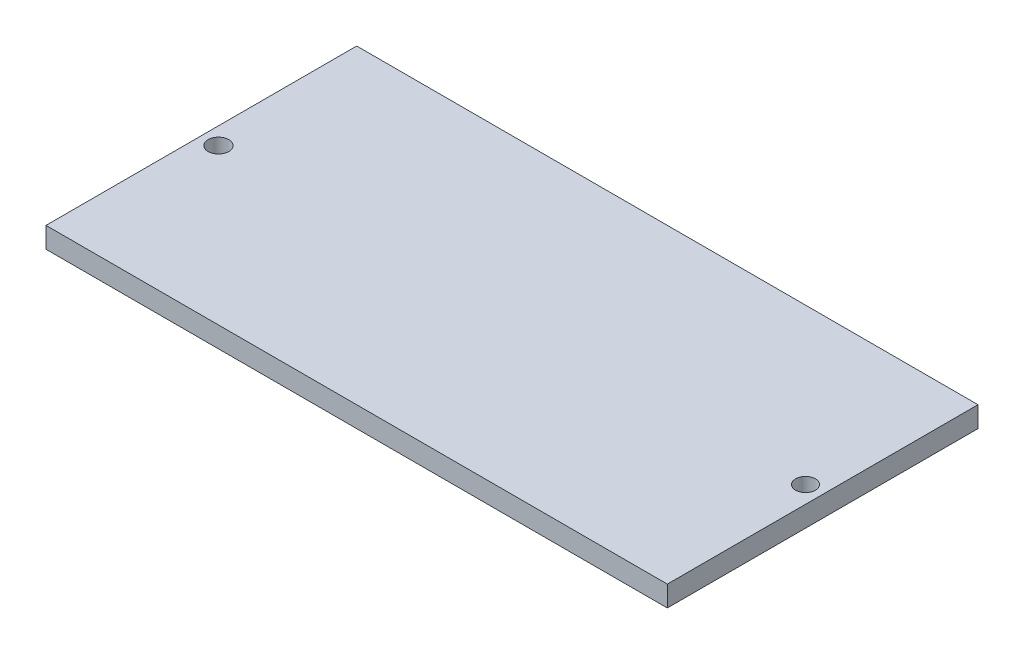
ISO-10303-21;
HEADER;
FILE_DESCRIPTION(('STEP AP214'),'2;1');
FILE_NAME('part.step','',(''),(''),'','','');
FILE_SCHEMA(('AUTOMOTIVE_DESIGN { 1 0 10303 214 1 1 1 1 }'));
ENDSEC;
DATA;
#1=APPLICATION_CONTEXT('core data for automotive mechanical design processes');
#2=APPLICATION_PROTOCOL_DEFINITION('international standard','automotive_design',2000,#1);
#3=PRODUCT_CONTEXT('',#1,'mechanical');
#4=PRODUCT('Part','Part','',(#3));
#5=PRODUCT_RELATED_PRODUCT_CATEGORY('part','',(#4));
#6=PRODUCT_DEFINITION_FORMATION('','',#4);
#7=PRODUCT_DEFINITION_CONTEXT('part definition',#1,'design');
#8=PRODUCT_DEFINITION('design','',#6,#7);
#9=PRODUCT_DEFINITION_SHAPE('','',#8);
#10=(LENGTH_UNIT() NAMED_UNIT(*) SI_UNIT(.MILLI.,.METRE.));
#11=(NAMED_UNIT(*) PLANE_ANGLE_UNIT() SI_UNIT($,.RADIAN.));
#12=(NAMED_UNIT(*) SI_UNIT($,.STERADIAN.) SOLID_ANGLE_UNIT());
#13=UNCERTAINTY_MEASURE_WITH_UNIT(LENGTH_MEASURE(1.E-05),#10,'distance_accuracy_value','');
#14=(GEOMETRIC_REPRESENTATION_CONTEXT(3) GLOBAL_UNCERTAINTY_ASSIGNED_CONTEXT((#13)) GLOBAL_UNIT_ASSIGNED_CONTEXT((#10,
#11,#12)) REPRESENTATION_CONTEXT('',''));
#15=CARTESIAN_POINT('',(0.,0.,0.));
#16=DIRECTION('',(0.,0.,1.));
#17=DIRECTION('',(1.,0.,0.));
#18=AXIS2_PLACEMENT_3D('',#15,#16,#17);
#19=CARTESIAN_POINT('',(0.,0.,0.));
#20=DIRECTION('',(0.,1.,0.));
#21=DIRECTION('',(0.,0.,1.));
#22=AXIS2_PLACEMENT_3D('',#19,#20,#21);
#23=PLANE('',#22);
#24=DIRECTION('',(-1.,0.,0.));
#25=VECTOR('',#24,1.);
#26=CARTESIAN_POINT('',(-7.4987736083239,0.,-10.));
#27=LINE('',#26,#25);
#28=CARTESIAN_POINT('',(-7.4987736083239,0.,-10.));
#29=VERTEX_POINT('',#28);
#30=CARTESIAN_POINT('',(-8.96194894653345,0.,-10.));
#31=VERTEX_POINT('',#30);
#32=EDGE_CURVE('E196',#29,#31,#27,.T.);
#33=ORIENTED_EDGE('',*,*,#32,.T.);
#34=DIRECTION('',(0.,0.,1.));
#35=VECTOR('',#34,1.);
#36=CARTESIAN_POINT('',(-8.96194894653345,0.,-10.));
#37=LINE('',#36,#35);
#38=CARTESIAN_POINT('',(-8.96194894653345,0.,10.));
#39=VERTEX_POINT('',#38);
#40=EDGE_CURVE('E181',#31,#39,#37,.T.);
#41=ORIENTED_EDGE('',*,*,#40,.T.);
#42=DIRECTION('',(-1.,0.,0.));
#43=VECTOR('',#42,1.);
#44=CARTESIAN_POINT('',(-7.4987736083239,0.,10.));
#45=LINE('',#44,#43);
#46=CARTESIAN_POINT('',(-7.4987736083239,0.,10.));
#47=VERTEX_POINT('',#46);
#48=EDGE_CURVE('E186',#47,#39,#45,.T.);
#49=ORIENTED_EDGE('',*,*,#48,.F.);
#50=DIRECTION('',(0.,0.,1.));
#51=VECTOR('',#50,1.);
#52=CARTESIAN_POINT('',(-7.4987736083239,0.,-10.));
#53=LINE('',#52,#51);
#54=EDGE_CURVE('E282',#29,#47,#53,.T.);
#55=ORIENTED_EDGE('',*,*,#54,.F.);
#56=EDGE_LOOP('',(#33,#41,#49,#55));
#57=FACE_BOUND('',#56,.T.);
#58=DIRECTION('',(0.,0.,1.));
#59=VECTOR('',#58,1.);
#60=CARTESIAN_POINT('',(22.508563909056,0.,-10.));
#61=LINE('',#60,#59);
#62=CARTESIAN_POINT('',(22.508563909056,0.,-10.));
#63=VERTEX_POINT('',#62);
#64=CARTESIAN_POINT('',(22.508563909056,0.,10.));
#65=VERTEX_POINT('',#64);
#66=EDGE_CURVE('E211',#63,#65,#61,.T.);
#67=ORIENTED_EDGE('',*,*,#66,.F.);
#68=DIRECTION('',(-1.,0.,0.));
#69=VECTOR('',#68,1.);
#70=CARTESIAN_POINT('',(22.508563909056,0.,-10.));
#71=LINE('',#70,#69);
#72=CARTESIAN_POINT('',(21.0453885708464,0.,-10.));
#73=VERTEX_POINT('',#72);
#74=EDGE_CURVE('E235',#63,#73,#71,.T.);
#75=ORIENTED_EDGE('',*,*,#74,.T.);
#76=DIRECTION('',(0.,0.,1.));
#77=VECTOR('',#76,1.);
#78=CARTESIAN_POINT('',(21.0453885708464,0.,-10.));
#79=LINE('',#78,#77);
#80=CARTESIAN_POINT('',(21.0453885708464,0.,10.));
#81=VERTEX_POINT('',#80);
#82=EDGE_CURVE('E214',#73,#81,#79,.T.);
#83=ORIENTED_EDGE('',*,*,#82,.T.);
#84=DIRECTION('',(-1.,0.,0.));
#85=VECTOR('',#84,1.);
#86=CARTESIAN_POINT('',(22.508563909056,0.,10.));
#87=LINE('',#86,#85);
#88=EDGE_CURVE('E258',#65,#81,#87,.T.);
#89=ORIENTED_EDGE('',*,*,#88,.F.);
#90=EDGE_LOOP('',(#67,#75,#83,#89));
#91=FACE_BOUND('',#90,.T.);
#92=DIRECTION('',(0.,0.,1.));
#93=VECTOR('',#92,1.);
#94=CARTESIAN_POINT('',(8.96194894653345,0.,-10.));
#95=LINE('',#94,#93);
#96=CARTESIAN_POINT('',(8.96194894653345,0.,-10.));
#97=VERTEX_POINT('',#96);
#98=CARTESIAN_POINT('',(8.96194894653345,0.,10.));
#99=VERTEX_POINT('',#98);
#100=EDGE_CURVE('E220',#97,#99,#95,.T.);
#101=ORIENTED_EDGE('',*,*,#100,.F.);
#102=DIRECTION('',(-1.,0.,0.));
#103=VECTOR('',#102,1.);
#104=CARTESIAN_POINT('',(7.4987736083239,0.,-10.));
#105=LINE('',#104,#103);
#106=CARTESIAN_POINT('',(7.4987736083239,0.,-10.));
#107=VERTEX_POINT('',#106);
#108=EDGE_CURVE('E208',#97,#107,#105,.T.);
#109=ORIENTED_EDGE('',*,*,#108,.T.);
#110=DIRECTION('',(0.,0.,1.));
#111=VECTOR('',#110,1.);
#112=CARTESIAN_POINT('',(7.4987736083239,0.,-10.));
#113=LINE('',#112,#111);
#114=CARTESIAN_POINT('',(7.4987736083239,0.,10.));
#115=VERTEX_POINT('',#114);
#116=EDGE_CURVE('E223',#107,#115,#113,.T.);
#117=ORIENTED_EDGE('',*,*,#116,.T.);
#118=DIRECTION('',(-1.,0.,0.));
#119=VECTOR('',#118,1.);
#120=CARTESIAN_POINT('',(7.4987736083239,0.,10.));
#121=LINE('',#120,#119);
#122=EDGE_CURVE('E246',#99,#115,#121,.T.);
#123=ORIENTED_EDGE('',*,*,#122,.F.);
#124=EDGE_LOOP('',(#101,#109,#117,#123));
#125=FACE_BOUND('',#124,.T.);
#126=CARTESIAN_POINT('',(28.3555340173799,0.,0.));
#127=DIRECTION('',(0.,1.,0.));
#128=DIRECTION('',(0.,0.,1.));
#129=AXIS2_PLACEMENT_3D('',#126,#127,#128);
#130=CIRCLE('',#129,0.958101179226239);
#131=CARTESIAN_POINT('',(28.3555340173799,0.,0.958101179226239));
#132=VERTEX_POINT('',#131);
#133=EDGE_CURVE('E269',#132,#132,#130,.T.);
#134=ORIENTED_EDGE('',*,*,#133,.T.);
#135=EDGE_LOOP('',(#134));
#136=FACE_BOUND('',#135,.T.);
#137=CARTESIAN_POINT('',(-28.3555340173799,0.,0.));
#138=DIRECTION('',(0.,1.,0.));
#139=DIRECTION('',(0.,0.,1.));
#140=AXIS2_PLACEMENT_3D('',#137,#138,#139);
#141=CIRCLE('',#140,1.);
#142=CARTESIAN_POINT('',(-28.3555340173799,0.,1.00000000000001));
#143=VERTEX_POINT('',#142);
#144=EDGE_CURVE('E279',#143,#143,#141,.T.);
#145=ORIENTED_EDGE('',*,*,#144,.T.);
#146=EDGE_LOOP('',(#145));
#147=FACE_BOUND('',#146,.T.);
#148=DIRECTION('',(0.,0.,1.));
#149=VECTOR('',#148,1.);
#150=CARTESIAN_POINT('',(-30.0073375173799,0.,15.0054759035991));
#151=LINE('',#150,#149);
#152=CARTESIAN_POINT('',(-30.0073375173799,0.,-15.0054759035991));
#153=VERTEX_POINT('',#152);
#154=CARTESIAN_POINT('',(-30.0073375173799,0.,15.0054759035991));
#155=VERTEX_POINT('',#154);
#156=EDGE_CURVE('E272',#153,#155,#151,.T.);
#157=ORIENTED_EDGE('',*,*,#156,.F.);
#158=DIRECTION('',(-1.,0.,0.));
#159=VECTOR('',#158,1.);
#160=CARTESIAN_POINT('',(30.0073375173799,0.,-15.0054759035991));
#161=LINE('',#160,#159);
#162=CARTESIAN_POINT('',(30.0073375173799,0.,-15.0054759035991));
#163=VERTEX_POINT('',#162);
#164=EDGE_CURVE('E287',#163,#153,#161,.T.);
#165=ORIENTED_EDGE('',*,*,#164,.F.);
#166=DIRECTION('',(0.,0.,-1.));
#167=VECTOR('',#166,1.);
#168=CARTESIAN_POINT('',(30.0073375173799,0.,15.0054759035991));
#169=LINE('',#168,#167);
#170=CARTESIAN_POINT('',(30.0073375173799,0.,15.0054759035991));
#171=VERTEX_POINT('',#170);
#172=EDGE_CURVE('E298',#171,#163,#169,.T.);
#173=ORIENTED_EDGE('',*,*,#172,.F.);
#174=DIRECTION('',(1.,0.,0.));
#175=VECTOR('',#174,1.);
#176=CARTESIAN_POINT('',(30.0073375173799,0.,15.0054759035991));
#177=LINE('',#176,#175);
#178=EDGE_CURVE('E296',#155,#171,#177,.T.);
#179=ORIENTED_EDGE('',*,*,#178,.F.);
#180=EDGE_LOOP('',(#157,#165,#173,#179));
#181=FACE_BOUND('',#180,.T.);
#182=DIRECTION('',(-1.,0.,0.));
#183=VECTOR('',#182,1.);
#184=CARTESIAN_POINT('',(-22.508563909056,0.,-10.));
#185=LINE('',#184,#183);
#186=CARTESIAN_POINT('',(-21.0453885708464,0.,-10.));
#187=VERTEX_POINT('',#186);
#188=CARTESIAN_POINT('',(-22.508563909056,0.,-10.));
#189=VERTEX_POINT('',#188);
#190=EDGE_CURVE('E594',#187,#189,#185,.T.);
#191=ORIENTED_EDGE('',*,*,#190,.T.);
#192=DIRECTION('',(0.,0.,1.));
#193=VECTOR('',#192,1.);
#194=CARTESIAN_POINT('',(-22.508563909056,0.,-10.));
#195=LINE('',#194,#193);
#196=CARTESIAN_POINT('',(-22.508563909056,0.,10.));
#197=VERTEX_POINT('',#196);
#198=EDGE_CURVE('E569',#189,#197,#195,.T.);
#199=ORIENTED_EDGE('',*,*,#198,.T.);
#200=DIRECTION('',(-1.,0.,0.));
#201=VECTOR('',#200,1.);
#202=CARTESIAN_POINT('',(-22.508563909056,0.,10.));
#203=LINE('',#202,#201);
#204=CARTESIAN_POINT('',(-21.0453885708464,0.,10.));
#205=VERTEX_POINT('',#204);
#206=EDGE_CURVE('E580',#205,#197,#203,.T.);
#207=ORIENTED_EDGE('',*,*,#206,.F.);
#208=DIRECTION('',(0.,0.,1.));
#209=VECTOR('',#208,1.);
#210=CARTESIAN_POINT('',(-21.0453885708464,0.,-10.));
#211=LINE('',#210,#209);
#212=EDGE_CURVE('E572',#187,#205,#211,.T.);
#213=ORIENTED_EDGE('',*,*,#212,.F.);
#214=EDGE_LOOP('',(#191,#199,#207,#213));
#215=FACE_BOUND('',#214,.T.);
#216=ADVANCED_FACE('F39',(#57,#91,#125,#136,#147,#181,#215),#23,.F.);
#217=CARTESIAN_POINT('',(-30.0073375173799,2.,15.0054759035991));
#218=DIRECTION('',(1.,0.,0.));
#219=DIRECTION('',(0.,0.,-1.));
#220=AXIS2_PLACEMENT_3D('',#217,#218,#219);
#221=PLANE('',#220);
#222=ORIENTED_EDGE('',*,*,#156,.T.);
#223=DIRECTION('',(0.,-1.,0.));
#224=VECTOR('',#223,1.);
#225=CARTESIAN_POINT('',(-30.0073375173799,2.,15.0054759035991));
#226=LINE('',#225,#224);
#227=CARTESIAN_POINT('',(-30.0073375173799,2.,15.0054759035991));
#228=VERTEX_POINT('',#227);
#229=EDGE_CURVE('E11',#228,#155,#226,.T.);
#230=ORIENTED_EDGE('',*,*,#229,.F.);
#231=DIRECTION('',(0.,0.,1.));
#232=VECTOR('',#231,1.);
#233=CARTESIAN_POINT('',(-30.0073375173799,2.,15.0054759035991));
#234=LINE('',#233,#232);
#235=CARTESIAN_POINT('',(-30.0073375173799,2.,-15.0054759035991));
#236=VERTEX_POINT('',#235);
#237=EDGE_CURVE('E283',#236,#228,#234,.T.);
#238=ORIENTED_EDGE('',*,*,#237,.F.);
#239=DIRECTION('',(0.,-1.,0.));
#240=VECTOR('',#239,1.);
#241=CARTESIAN_POINT('',(-30.0073375173799,2.,-15.0054759035991));
#242=LINE('',#241,#240);
#243=EDGE_CURVE('E293',#236,#153,#242,.T.);
#244=ORIENTED_EDGE('',*,*,#243,.T.);
#245=EDGE_LOOP('',(#222,#230,#238,#244));
#246=FACE_BOUND('',#245,.T.);
#247=ADVANCED_FACE('F41',(#246),#221,.F.);
#248=CARTESIAN_POINT('',(30.0073375173799,2.,15.0054759035991));
#249=DIRECTION('',(0.,0.,-1.));
#250=DIRECTION('',(-1.,0.,0.));
#251=AXIS2_PLACEMENT_3D('',#248,#249,#250);
#252=PLANE('',#251);
#253=ORIENTED_EDGE('',*,*,#178,.T.);
#254=DIRECTION('',(0.,-1.,0.));
#255=VECTOR('',#254,1.);
#256=CARTESIAN_POINT('',(30.0073375173799,2.,15.0054759035991));
#257=LINE('',#256,#255);
#258=CARTESIAN_POINT('',(30.0073375173799,2.,15.0054759035991));
#259=VERTEX_POINT('',#258);
#260=EDGE_CURVE('E47',#259,#171,#257,.T.);
#261=ORIENTED_EDGE('',*,*,#260,.F.);
#262=DIRECTION('',(1.,0.,0.));
#263=VECTOR('',#262,1.);
#264=CARTESIAN_POINT('',(30.0073375173799,2.,15.0054759035991));
#265=LINE('',#264,#263);
#266=EDGE_CURVE('E286',#228,#259,#265,.T.);
#267=ORIENTED_EDGE('',*,*,#266,.F.);
#268=ORIENTED_EDGE('',*,*,#229,.T.);
#269=EDGE_LOOP('',(#253,#261,#267,#268));
#270=FACE_BOUND('',#269,.T.);
#271=ADVANCED_FACE('F326',(#270),#252,.F.);
#272=CARTESIAN_POINT('',(30.0073375173799,2.,15.0054759035991));
#273=DIRECTION('',(-1.,0.,0.));
#274=DIRECTION('',(0.,0.,1.));
#275=AXIS2_PLACEMENT_3D('',#272,#273,#274);
#276=PLANE('',#275);
#277=ORIENTED_EDGE('',*,*,#172,.T.);
#278=DIRECTION('',(0.,-1.,0.));
#279=VECTOR('',#278,1.);
#280=CARTESIAN_POINT('',(30.0073375173799,2.,-15.0054759035991));
#281=LINE('',#280,#279);
#282=CARTESIAN_POINT('',(30.0073375173799,2.,-15.0054759035991));
#283=VERTEX_POINT('',#282);
#284=EDGE_CURVE('E303',#283,#163,#281,.T.);
#285=ORIENTED_EDGE('',*,*,#284,.F.);
#286=DIRECTION('',(0.,0.,-1.));
#287=VECTOR('',#286,1.);
#288=CARTESIAN_POINT('',(30.0073375173799,2.,15.0054759035991));
#289=LINE('',#288,#287);
#290=EDGE_CURVE('E289',#259,#283,#289,.T.);
#291=ORIENTED_EDGE('',*,*,#290,.F.);
#292=ORIENTED_EDGE('',*,*,#260,.T.);
#293=EDGE_LOOP('',(#277,#285,#291,#292));
#294=FACE_BOUND('',#293,.T.);
#295=ADVANCED_FACE('F310',(#294),#276,.F.);
#296=CARTESIAN_POINT('',(30.0073375173799,2.,-15.0054759035991));
#297=DIRECTION('',(0.,0.,1.));
#298=DIRECTION('',(1.,0.,0.));
#299=AXIS2_PLACEMENT_3D('',#296,#297,#298);
#300=PLANE('',#299);
#301=ORIENTED_EDGE('',*,*,#164,.T.);
#302=ORIENTED_EDGE('',*,*,#243,.F.);
#303=DIRECTION('',(-1.,0.,0.));
#304=VECTOR('',#303,1.);
#305=CARTESIAN_POINT('',(30.0073375173799,2.,-15.0054759035991));
#306=LINE('',#305,#304);
#307=EDGE_CURVE('E291',#283,#236,#306,.T.);
#308=ORIENTED_EDGE('',*,*,#307,.F.);
#309=ORIENTED_EDGE('',*,*,#284,.T.);
#310=EDGE_LOOP('',(#301,#302,#308,#309));
#311=FACE_BOUND('',#310,.T.);
#312=ADVANCED_FACE('F319',(#311),#300,.F.);
#313=CARTESIAN_POINT('',(0.,2.,0.));
#314=DIRECTION('',(0.,1.,0.));
#315=DIRECTION('',(0.,0.,1.));
#316=AXIS2_PLACEMENT_3D('',#313,#314,#315);
#317=PLANE('',#316);
#318=CARTESIAN_POINT('',(28.3555340173799,2.,0.));
#319=DIRECTION('',(0.,1.,0.));
#320=DIRECTION('',(0.,0.,1.));
#321=AXIS2_PLACEMENT_3D('',#318,#319,#320);
#322=CIRCLE('',#321,0.958101179226239);
#323=CARTESIAN_POINT('',(28.3555340173799,2.,0.958101179226239));
#324=VERTEX_POINT('',#323);
#325=EDGE_CURVE('E273',#324,#324,#322,.T.);
#326=ORIENTED_EDGE('',*,*,#325,.F.);
#327=EDGE_LOOP('',(#326));
#328=FACE_BOUND('',#327,.T.);
#329=CARTESIAN_POINT('',(-28.3555340173799,2.,0.));
#330=DIRECTION('',(0.,1.,0.));
#331=DIRECTION('',(0.,0.,1.));
#332=AXIS2_PLACEMENT_3D('',#329,#330,#331);
#333=CIRCLE('',#332,1.);
#334=CARTESIAN_POINT('',(-28.3555340173799,2.,1.00000000000001));
#335=VERTEX_POINT('',#334);
#336=EDGE_CURVE('E276',#335,#335,#333,.T.);
#337=ORIENTED_EDGE('',*,*,#336,.F.);
#338=EDGE_LOOP('',(#337));
#339=FACE_BOUND('',#338,.T.);
#340=ORIENTED_EDGE('',*,*,#237,.T.);
#341=ORIENTED_EDGE('',*,*,#266,.T.);
#342=ORIENTED_EDGE('',*,*,#290,.T.);
#343=ORIENTED_EDGE('',*,*,#307,.T.);
#344=EDGE_LOOP('',(#340,#341,#342,#343));
#345=FACE_BOUND('',#344,.T.);
#346=ADVANCED_FACE('F325',(#328,#339,#345),#317,.T.);
#347=CARTESIAN_POINT('',(-28.3555340173799,0.,0.));
#348=DIRECTION('',(0.,1.,0.));
#349=DIRECTION('',(0.,0.,1.));
#350=AXIS2_PLACEMENT_3D('',#347,#348,#349);
#351=CYLINDRICAL_SURFACE('',#350,1.);
#352=ORIENTED_EDGE('',*,*,#144,.F.);
#353=EDGE_LOOP('',(#352));
#354=FACE_BOUND('',#353,.T.);
#355=ORIENTED_EDGE('',*,*,#336,.T.);
#356=EDGE_LOOP('',(#355));
#357=FACE_BOUND('',#356,.T.);
#358=ADVANCED_FACE('F346',(#354,#357),#351,.F.);
#359=CARTESIAN_POINT('',(28.3555340173799,0.,0.));
#360=DIRECTION('',(0.,1.,0.));
#361=DIRECTION('',(0.,0.,1.));
#362=AXIS2_PLACEMENT_3D('',#359,#360,#361);
#363=CYLINDRICAL_SURFACE('',#362,0.958101179226239);
#364=ORIENTED_EDGE('',*,*,#133,.F.);
#365=EDGE_LOOP('',(#364));
#366=FACE_BOUND('',#365,.T.);
#367=ORIENTED_EDGE('',*,*,#325,.T.);
#368=EDGE_LOOP('',(#367));
#369=FACE_BOUND('',#368,.T.);
#370=ADVANCED_FACE('F351',(#366,#369),#363,.F.);
#371=CARTESIAN_POINT('',(7.4987736083239,0.,-10.));
#372=DIRECTION('',(-1.,0.,0.));
#373=DIRECTION('',(0.,0.,1.));
#374=AXIS2_PLACEMENT_3D('',#371,#372,#373);
#375=PLANE('',#374);
#376=DIRECTION('',(0.,0.,1.));
#377=VECTOR('',#376,1.);
#378=CARTESIAN_POINT('',(7.4987736083239,-4.51739033783182,-10.));
#379=LINE('',#378,#377);
#380=CARTESIAN_POINT('',(7.4987736083239,-4.51739033783182,-10.));
#381=VERTEX_POINT('',#380);
#382=CARTESIAN_POINT('',(7.4987736083239,-4.51739033783182,10.));
#383=VERTEX_POINT('',#382);
#384=EDGE_CURVE('E206',#381,#383,#379,.T.);
#385=ORIENTED_EDGE('',*,*,#384,.T.);
#386=DIRECTION('',(0.,-1.,0.));
#387=VECTOR('',#386,1.);
#388=CARTESIAN_POINT('',(7.4987736083239,0.,10.));
#389=LINE('',#388,#387);
#390=EDGE_CURVE('E192',#115,#383,#389,.T.);
#391=ORIENTED_EDGE('',*,*,#390,.F.);
#392=ORIENTED_EDGE('',*,*,#116,.F.);
#393=DIRECTION('',(0.,-1.,0.));
#394=VECTOR('',#393,1.);
#395=CARTESIAN_POINT('',(7.4987736083239,0.,-10.));
#396=LINE('',#395,#394);
#397=EDGE_CURVE('E243',#107,#381,#396,.T.);
#398=ORIENTED_EDGE('',*,*,#397,.T.);
#399=EDGE_LOOP('',(#385,#391,#392,#398));
#400=FACE_BOUND('',#399,.T.);
#401=ADVANCED_FACE('F358',(#400),#375,.T.);
#402=CARTESIAN_POINT('',(8.96194894653345,0.,-10.));
#403=DIRECTION('',(1.,0.,0.));
#404=DIRECTION('',(0.,0.,-1.));
#405=AXIS2_PLACEMENT_3D('',#402,#403,#404);
#406=PLANE('',#405);
#407=ORIENTED_EDGE('',*,*,#100,.T.);
#408=DIRECTION('',(0.,1.,0.));
#409=VECTOR('',#408,1.);
#410=CARTESIAN_POINT('',(8.96194894653345,0.,10.));
#411=LINE('',#410,#409);
#412=CARTESIAN_POINT('',(8.96194894653345,-3.1761462778064,10.));
#413=VERTEX_POINT('',#412);
#414=EDGE_CURVE('E249',#413,#99,#411,.T.);
#415=ORIENTED_EDGE('',*,*,#414,.F.);
#416=DIRECTION('',(0.,0.,1.));
#417=VECTOR('',#416,1.);
#418=CARTESIAN_POINT('',(8.96194894653345,-3.1761462778064,-10.));
#419=LINE('',#418,#417);
#420=CARTESIAN_POINT('',(8.96194894653345,-3.1761462778064,-10.));
#421=VERTEX_POINT('',#420);
#422=EDGE_CURVE('E218',#421,#413,#419,.T.);
#423=ORIENTED_EDGE('',*,*,#422,.F.);
#424=DIRECTION('',(0.,1.,0.));
#425=VECTOR('',#424,1.);
#426=CARTESIAN_POINT('',(8.96194894653345,0.,-10.));
#427=LINE('',#426,#425);
#428=EDGE_CURVE('E226',#421,#97,#427,.T.);
#429=ORIENTED_EDGE('',*,*,#428,.T.);
#430=EDGE_LOOP('',(#407,#415,#423,#429));
#431=FACE_BOUND('',#430,.T.);
#432=ADVANCED_FACE('F363',(#431),#406,.T.);
#433=CARTESIAN_POINT('',(21.0453885708464,-3.1761462778064,-10.));
#434=DIRECTION('',(0.,1.,0.));
#435=DIRECTION('',(0.,0.,1.));
#436=AXIS2_PLACEMENT_3D('',#433,#434,#435);
#437=PLANE('',#436);
#438=ORIENTED_EDGE('',*,*,#422,.T.);
#439=DIRECTION('',(-1.,0.,0.));
#440=VECTOR('',#439,1.);
#441=CARTESIAN_POINT('',(21.0453885708464,-3.1761462778064,10.));
#442=LINE('',#441,#440);
#443=CARTESIAN_POINT('',(21.0453885708464,-3.1761462778064,10.));
#444=VERTEX_POINT('',#443);
#445=EDGE_CURVE('E252',#444,#413,#442,.T.);
#446=ORIENTED_EDGE('',*,*,#445,.F.);
#447=DIRECTION('',(0.,0.,1.));
#448=VECTOR('',#447,1.);
#449=CARTESIAN_POINT('',(21.0453885708464,-3.1761462778064,-10.));
#450=LINE('',#449,#448);
#451=CARTESIAN_POINT('',(21.0453885708464,-3.1761462778064,-10.));
#452=VERTEX_POINT('',#451);
#453=EDGE_CURVE('E216',#452,#444,#450,.T.);
#454=ORIENTED_EDGE('',*,*,#453,.F.);
#455=DIRECTION('',(-1.,0.,0.));
#456=VECTOR('',#455,1.);
#457=CARTESIAN_POINT('',(21.0453885708464,-3.1761462778064,-10.));
#458=LINE('',#457,#456);
#459=EDGE_CURVE('E229',#452,#421,#458,.T.);
#460=ORIENTED_EDGE('',*,*,#459,.T.);
#461=EDGE_LOOP('',(#438,#446,#454,#460));
#462=FACE_BOUND('',#461,.T.);
#463=ADVANCED_FACE('F380',(#462),#437,.T.);
#464=CARTESIAN_POINT('',(21.0453885708464,0.,-10.));
#465=DIRECTION('',(-1.,0.,0.));
#466=DIRECTION('',(0.,0.,1.));
#467=AXIS2_PLACEMENT_3D('',#464,#465,#466);
#468=PLANE('',#467);
#469=ORIENTED_EDGE('',*,*,#453,.T.);
#470=DIRECTION('',(0.,-1.,0.));
#471=VECTOR('',#470,1.);
#472=CARTESIAN_POINT('',(21.0453885708464,0.,10.));
#473=LINE('',#472,#471);
#474=EDGE_CURVE('E255',#81,#444,#473,.T.);
#475=ORIENTED_EDGE('',*,*,#474,.F.);
#476=ORIENTED_EDGE('',*,*,#82,.F.);
#477=DIRECTION('',(0.,-1.,0.));
#478=VECTOR('',#477,1.);
#479=CARTESIAN_POINT('',(21.0453885708464,0.,-10.));
#480=LINE('',#479,#478);
#481=EDGE_CURVE('E232',#73,#452,#480,.T.);
#482=ORIENTED_EDGE('',*,*,#481,.T.);
#483=EDGE_LOOP('',(#469,#475,#476,#482));
#484=FACE_BOUND('',#483,.T.);
#485=ADVANCED_FACE('F384',(#484),#468,.T.);
#486=CARTESIAN_POINT('',(22.508563909056,0.,-10.));
#487=DIRECTION('',(1.,0.,0.));
#488=DIRECTION('',(0.,0.,-1.));
#489=AXIS2_PLACEMENT_3D('',#486,#487,#488);
#490=PLANE('',#489);
#491=ORIENTED_EDGE('',*,*,#66,.T.);
#492=DIRECTION('',(0.,1.,0.));
#493=VECTOR('',#492,1.);
#494=CARTESIAN_POINT('',(22.508563909056,0.,10.));
#495=LINE('',#494,#493);
#496=CARTESIAN_POINT('',(22.508563909056,-4.51739033783182,10.));
#497=VERTEX_POINT('',#496);
#498=EDGE_CURVE('E261',#497,#65,#495,.T.);
#499=ORIENTED_EDGE('',*,*,#498,.F.);
#500=DIRECTION('',(0.,0.,1.));
#501=VECTOR('',#500,1.);
#502=CARTESIAN_POINT('',(22.508563909056,-4.51739033783182,-10.));
#503=LINE('',#502,#501);
#504=CARTESIAN_POINT('',(22.508563909056,-4.51739033783182,-10.));
#505=VERTEX_POINT('',#504);
#506=EDGE_CURVE('E209',#505,#497,#503,.T.);
#507=ORIENTED_EDGE('',*,*,#506,.F.);
#508=DIRECTION('',(0.,1.,0.));
#509=VECTOR('',#508,1.);
#510=CARTESIAN_POINT('',(22.508563909056,0.,-10.));
#511=LINE('',#510,#509);
#512=EDGE_CURVE('E237',#505,#63,#511,.T.);
#513=ORIENTED_EDGE('',*,*,#512,.T.);
#514=EDGE_LOOP('',(#491,#499,#507,#513));
#515=FACE_BOUND('',#514,.T.);
#516=ADVANCED_FACE('F388',(#515),#490,.T.);
#517=CARTESIAN_POINT('',(22.508563909056,-4.51739033783182,-10.));
#518=DIRECTION('',(0.,-1.,0.));
#519=DIRECTION('',(0.,0.,-1.));
#520=AXIS2_PLACEMENT_3D('',#517,#518,#519);
#521=PLANE('',#520);
#522=ORIENTED_EDGE('',*,*,#506,.T.);
#523=DIRECTION('',(1.,0.,0.));
#524=VECTOR('',#523,1.);
#525=CARTESIAN_POINT('',(22.508563909056,-4.51739033783182,10.));
#526=LINE('',#525,#524);
#527=EDGE_CURVE('E264',#383,#497,#526,.T.);
#528=ORIENTED_EDGE('',*,*,#527,.F.);
#529=ORIENTED_EDGE('',*,*,#384,.F.);
#530=DIRECTION('',(1.,0.,0.));
#531=VECTOR('',#530,1.);
#532=CARTESIAN_POINT('',(22.508563909056,-4.51739033783182,-10.));
#533=LINE('',#532,#531);
#534=EDGE_CURVE('E240',#381,#505,#533,.T.);
#535=ORIENTED_EDGE('',*,*,#534,.T.);
#536=EDGE_LOOP('',(#522,#528,#529,#535));
#537=FACE_BOUND('',#536,.T.);
#538=ADVANCED_FACE('F376',(#537),#521,.T.);
#539=CARTESIAN_POINT('',(0.,0.,-10.));
#540=DIRECTION('',(0.,0.,-1.));
#541=DIRECTION('',(-1.,0.,0.));
#542=AXIS2_PLACEMENT_3D('',#539,#540,#541);
#543=PLANE('',#542);
#544=ORIENTED_EDGE('',*,*,#397,.F.);
#545=ORIENTED_EDGE('',*,*,#108,.F.);
#546=ORIENTED_EDGE('',*,*,#428,.F.);
#547=ORIENTED_EDGE('',*,*,#459,.F.);
#548=ORIENTED_EDGE('',*,*,#481,.F.);
#549=ORIENTED_EDGE('',*,*,#74,.F.);
#550=ORIENTED_EDGE('',*,*,#512,.F.);
#551=ORIENTED_EDGE('',*,*,#534,.F.);
#552=EDGE_LOOP('',(#544,#545,#546,#547,#548,#549,#550,#551));
#553=FACE_BOUND('',#552,.T.);
#554=ADVANCED_FACE('F372',(#553),#543,.T.);
#555=CARTESIAN_POINT('',(0.,0.,10.));
#556=DIRECTION('',(0.,0.,-1.));
#557=DIRECTION('',(-1.,0.,0.));
#558=AXIS2_PLACEMENT_3D('',#555,#556,#557);
#559=PLANE('',#558);
#560=ORIENTED_EDGE('',*,*,#390,.T.);
#561=ORIENTED_EDGE('',*,*,#527,.T.);
#562=ORIENTED_EDGE('',*,*,#498,.T.);
#563=ORIENTED_EDGE('',*,*,#88,.T.);
#564=ORIENTED_EDGE('',*,*,#474,.T.);
#565=ORIENTED_EDGE('',*,*,#445,.T.);
#566=ORIENTED_EDGE('',*,*,#414,.T.);
#567=ORIENTED_EDGE('',*,*,#122,.T.);
#568=EDGE_LOOP('',(#560,#561,#562,#563,#564,#565,#566,#567));
#569=FACE_BOUND('',#568,.T.);
#570=ADVANCED_FACE('F368',(#569),#559,.F.);
#571=CARTESIAN_POINT('',(-7.4987736083239,0.,-10.));
#572=DIRECTION('',(1.,0.,0.));
#573=DIRECTION('',(0.,0.,-1.));
#574=AXIS2_PLACEMENT_3D('',#571,#572,#573);
#575=PLANE('',#574);
#576=ORIENTED_EDGE('',*,*,#54,.T.);
#577=DIRECTION('',(0.,1.,0.));
#578=VECTOR('',#577,1.);
#579=CARTESIAN_POINT('',(-7.4987736083239,0.,10.));
#580=LINE('',#579,#578);
#581=CARTESIAN_POINT('',(-7.4987736083239,-4.51739033783182,10.));
#582=VERTEX_POINT('',#581);
#583=EDGE_CURVE('E61',#582,#47,#580,.T.);
#584=ORIENTED_EDGE('',*,*,#583,.F.);
#585=DIRECTION('',(0.,0.,1.));
#586=VECTOR('',#585,1.);
#587=CARTESIAN_POINT('',(-7.4987736083239,-4.51739033783182,-10.));
#588=LINE('',#587,#586);
#589=CARTESIAN_POINT('',(-7.4987736083239,-4.51739033783182,-10.));
#590=VERTEX_POINT('',#589);
#591=EDGE_CURVE('E561',#590,#582,#588,.T.);
#592=ORIENTED_EDGE('',*,*,#591,.F.);
#593=DIRECTION('',(0.,1.,0.));
#594=VECTOR('',#593,1.);
#595=CARTESIAN_POINT('',(-7.4987736083239,0.,-10.));
#596=LINE('',#595,#594);
#597=EDGE_CURVE('E197',#590,#29,#596,.T.);
#598=ORIENTED_EDGE('',*,*,#597,.T.);
#599=EDGE_LOOP('',(#576,#584,#592,#598));
#600=FACE_BOUND('',#599,.T.);
#601=ADVANCED_FACE('F371',(#600),#575,.T.);
#602=CARTESIAN_POINT('',(-22.508563909056,-4.51739033783182,-10.));
#603=DIRECTION('',(0.,-1.,0.));
#604=DIRECTION('',(0.,0.,-1.));
#605=AXIS2_PLACEMENT_3D('',#602,#603,#604);
#606=PLANE('',#605);
#607=ORIENTED_EDGE('',*,*,#591,.T.);
#608=DIRECTION('',(1.,0.,0.));
#609=VECTOR('',#608,1.);
#610=CARTESIAN_POINT('',(-22.508563909056,-4.51739033783182,10.));
#611=LINE('',#610,#609);
#612=CARTESIAN_POINT('',(-22.508563909056,-4.51739033783182,10.));
#613=VERTEX_POINT('',#612);
#614=EDGE_CURVE('E587',#613,#582,#611,.T.);
#615=ORIENTED_EDGE('',*,*,#614,.F.);
#616=DIRECTION('',(0.,0.,1.));
#617=VECTOR('',#616,1.);
#618=CARTESIAN_POINT('',(-22.508563909056,-4.51739033783182,-10.));
#619=LINE('',#618,#617);
#620=CARTESIAN_POINT('',(-22.508563909056,-4.51739033783182,-10.));
#621=VERTEX_POINT('',#620);
#622=EDGE_CURVE('E564',#621,#613,#619,.T.);
#623=ORIENTED_EDGE('',*,*,#622,.F.);
#624=DIRECTION('',(1.,0.,0.));
#625=VECTOR('',#624,1.);
#626=CARTESIAN_POINT('',(-22.508563909056,-4.51739033783182,-10.));
#627=LINE('',#626,#625);
#628=EDGE_CURVE('E202',#621,#590,#627,.T.);
#629=ORIENTED_EDGE('',*,*,#628,.T.);
#630=EDGE_LOOP('',(#607,#615,#623,#629));
#631=FACE_BOUND('',#630,.T.);
#632=ADVANCED_FACE('F410',(#631),#606,.T.);
#633=CARTESIAN_POINT('',(-22.508563909056,0.,-10.));
#634=DIRECTION('',(-1.,0.,0.));
#635=DIRECTION('',(0.,0.,1.));
#636=AXIS2_PLACEMENT_3D('',#633,#634,#635);
#637=PLANE('',#636);
#638=ORIENTED_EDGE('',*,*,#622,.T.);
#639=DIRECTION('',(0.,-1.,0.));
#640=VECTOR('',#639,1.);
#641=CARTESIAN_POINT('',(-22.508563909056,0.,10.));
#642=LINE('',#641,#640);
#643=EDGE_CURVE('E582',#197,#613,#642,.T.);
#644=ORIENTED_EDGE('',*,*,#643,.F.);
#645=ORIENTED_EDGE('',*,*,#198,.F.);
#646=DIRECTION('',(0.,-1.,0.));
#647=VECTOR('',#646,1.);
#648=CARTESIAN_POINT('',(-22.508563909056,0.,-10.));
#649=LINE('',#648,#647);
#650=EDGE_CURVE('E597',#189,#621,#649,.T.);
#651=ORIENTED_EDGE('',*,*,#650,.T.);
#652=EDGE_LOOP('',(#638,#644,#645,#651));
#653=FACE_BOUND('',#652,.T.);
#654=ADVANCED_FACE('F406',(#653),#637,.T.);
#655=CARTESIAN_POINT('',(-21.0453885708464,0.,-10.));
#656=DIRECTION('',(1.,0.,0.));
#657=DIRECTION('',(0.,0.,-1.));
#658=AXIS2_PLACEMENT_3D('',#655,#656,#657);
#659=PLANE('',#658);
#660=ORIENTED_EDGE('',*,*,#212,.T.);
#661=DIRECTION('',(0.,1.,0.));
#662=VECTOR('',#661,1.);
#663=CARTESIAN_POINT('',(-21.0453885708464,0.,10.));
#664=LINE('',#663,#662);
#665=CARTESIAN_POINT('',(-21.0453885708464,-3.1761462778064,10.));
#666=VERTEX_POINT('',#665);
#667=EDGE_CURVE('E54',#666,#205,#664,.T.);
#668=ORIENTED_EDGE('',*,*,#667,.F.);
#669=DIRECTION('',(0.,0.,1.));
#670=VECTOR('',#669,1.);
#671=CARTESIAN_POINT('',(-21.0453885708464,-3.1761462778064,-10.));
#672=LINE('',#671,#670);
#673=CARTESIAN_POINT('',(-21.0453885708464,-3.1761462778064,-10.));
#674=VERTEX_POINT('',#673);
#675=EDGE_CURVE('E199',#674,#666,#672,.T.);
#676=ORIENTED_EDGE('',*,*,#675,.F.);
#677=DIRECTION('',(0.,1.,0.));
#678=VECTOR('',#677,1.);
#679=CARTESIAN_POINT('',(-21.0453885708464,0.,-10.));
#680=LINE('',#679,#678);
#681=EDGE_CURVE('E592',#674,#187,#680,.T.);
#682=ORIENTED_EDGE('',*,*,#681,.T.);
#683=EDGE_LOOP('',(#660,#668,#676,#682));
#684=FACE_BOUND('',#683,.T.);
#685=ADVANCED_FACE('F402',(#684),#659,.T.);
#686=CARTESIAN_POINT('',(-21.0453885708464,-3.1761462778064,-10.));
#687=DIRECTION('',(0.,1.,0.));
#688=DIRECTION('',(0.,0.,1.));
#689=AXIS2_PLACEMENT_3D('',#686,#687,#688);
#690=PLANE('',#689);
#691=ORIENTED_EDGE('',*,*,#675,.T.);
#692=DIRECTION('',(-1.,0.,0.));
#693=VECTOR('',#692,1.);
#694=CARTESIAN_POINT('',(-21.0453885708464,-3.1761462778064,10.));
#695=LINE('',#694,#693);
#696=CARTESIAN_POINT('',(-8.96194894653345,-3.1761462778064,10.));
#697=VERTEX_POINT('',#696);
#698=EDGE_CURVE('E185',#697,#666,#695,.T.);
#699=ORIENTED_EDGE('',*,*,#698,.F.);
#700=DIRECTION('',(0.,0.,1.));
#701=VECTOR('',#700,1.);
#702=CARTESIAN_POINT('',(-8.96194894653345,-3.1761462778064,-10.));
#703=LINE('',#702,#701);
#704=CARTESIAN_POINT('',(-8.96194894653345,-3.1761462778064,-10.));
#705=VERTEX_POINT('',#704);
#706=EDGE_CURVE('E183',#705,#697,#703,.T.);
#707=ORIENTED_EDGE('',*,*,#706,.F.);
#708=DIRECTION('',(-1.,0.,0.));
#709=VECTOR('',#708,1.);
#710=CARTESIAN_POINT('',(-21.0453885708464,-3.1761462778064,-10.));
#711=LINE('',#710,#709);
#712=EDGE_CURVE('E574',#705,#674,#711,.T.);
#713=ORIENTED_EDGE('',*,*,#712,.T.);
#714=EDGE_LOOP('',(#691,#699,#707,#713));
#715=FACE_BOUND('',#714,.T.);
#716=ADVANCED_FACE('F399',(#715),#690,.T.);
#717=CARTESIAN_POINT('',(-8.96194894653345,0.,-10.));
#718=DIRECTION('',(-1.,0.,0.));
#719=DIRECTION('',(0.,0.,1.));
#720=AXIS2_PLACEMENT_3D('',#717,#718,#719);
#721=PLANE('',#720);
#722=ORIENTED_EDGE('',*,*,#706,.T.);
#723=DIRECTION('',(0.,-1.,0.));
#724=VECTOR('',#723,1.);
#725=CARTESIAN_POINT('',(-8.96194894653345,0.,10.));
#726=LINE('',#725,#724);
#727=EDGE_CURVE('E177',#39,#697,#726,.T.);
#728=ORIENTED_EDGE('',*,*,#727,.F.);
#729=ORIENTED_EDGE('',*,*,#40,.F.);
#730=DIRECTION('',(0.,-1.,0.));
#731=VECTOR('',#730,1.);
#732=CARTESIAN_POINT('',(-8.96194894653345,0.,-10.));
#733=LINE('',#732,#731);
#734=EDGE_CURVE('E559',#31,#705,#733,.T.);
#735=ORIENTED_EDGE('',*,*,#734,.T.);
#736=EDGE_LOOP('',(#722,#728,#729,#735));
#737=FACE_BOUND('',#736,.T.);
#738=ADVANCED_FACE('F178',(#737),#721,.T.);
#739=CARTESIAN_POINT('',(0.,0.,-10.));
#740=DIRECTION('',(0.,0.,1.));
#741=DIRECTION('',(1.,0.,0.));
#742=AXIS2_PLACEMENT_3D('',#739,#740,#741);
#743=PLANE('',#742);
#744=ORIENTED_EDGE('',*,*,#32,.F.);
#745=ORIENTED_EDGE('',*,*,#597,.F.);
#746=ORIENTED_EDGE('',*,*,#628,.F.);
#747=ORIENTED_EDGE('',*,*,#650,.F.);
#748=ORIENTED_EDGE('',*,*,#190,.F.);
#749=ORIENTED_EDGE('',*,*,#681,.F.);
#750=ORIENTED_EDGE('',*,*,#712,.F.);
#751=ORIENTED_EDGE('',*,*,#734,.F.);
#752=EDGE_LOOP('',(#744,#745,#746,#747,#748,#749,#750,#751));
#753=FACE_BOUND('',#752,.T.);
#754=ADVANCED_FACE('F398',(#753),#743,.F.);
#755=CARTESIAN_POINT('',(0.,0.,10.));
#756=DIRECTION('',(0.,0.,1.));
#757=DIRECTION('',(1.,0.,0.));
#758=AXIS2_PLACEMENT_3D('',#755,#756,#757);
#759=PLANE('',#758);
#760=ORIENTED_EDGE('',*,*,#48,.T.);
#761=ORIENTED_EDGE('',*,*,#727,.T.);
#762=ORIENTED_EDGE('',*,*,#698,.T.);
#763=ORIENTED_EDGE('',*,*,#667,.T.);
#764=ORIENTED_EDGE('',*,*,#206,.T.);
#765=ORIENTED_EDGE('',*,*,#643,.T.);
#766=ORIENTED_EDGE('',*,*,#614,.T.);
#767=ORIENTED_EDGE('',*,*,#583,.T.);
#768=EDGE_LOOP('',(#760,#761,#762,#763,#764,#765,#766,#767));
#769=FACE_BOUND('',#768,.T.);
#770=ADVANCED_FACE('F189',(#769),#759,.T.);
#771=CLOSED_SHELL('',(#216,#247,#271,#295,#312,#346,#358,#370,#401,#432,#463,#485,#516,#538,
#554,#570,#601,#632,#654,#685,#716,#738,#754,#770));
#772=MANIFOLD_SOLID_BREP('B2',#771);
#773=ADVANCED_BREP_SHAPE_REPRESENTATION('',(#18,#772),#14);
#774=SHAPE_DEFINITION_REPRESENTATION(#9,#773);
ENDSEC;
END-ISO-10303-21;
